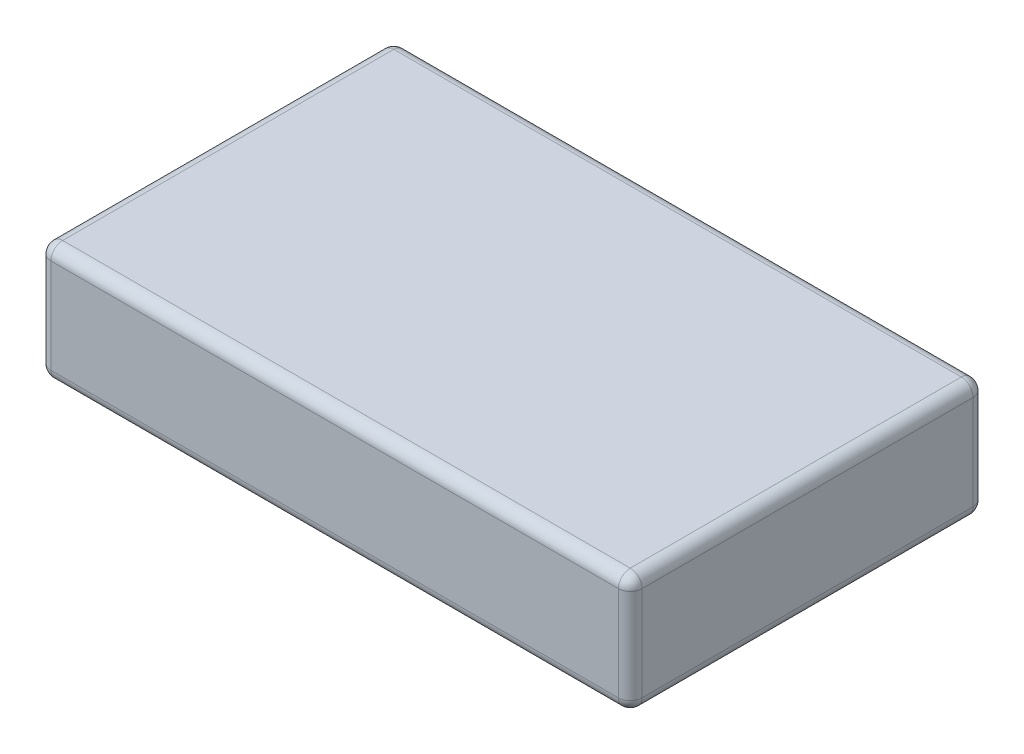
ISO-10303-21;
HEADER;
FILE_DESCRIPTION(('STEP AP214'),'2;1');
FILE_NAME('part.step','',(''),(''),'','','');
FILE_SCHEMA(('AUTOMOTIVE_DESIGN { 1 0 10303 214 1 1 1 1 }'));
ENDSEC;
DATA;
#1=APPLICATION_CONTEXT('core data for automotive mechanical design processes');
#2=APPLICATION_PROTOCOL_DEFINITION('international standard','automotive_design',2000,#1);
#3=PRODUCT_CONTEXT('',#1,'mechanical');
#4=PRODUCT('Part','Part','',(#3));
#5=PRODUCT_RELATED_PRODUCT_CATEGORY('part','',(#4));
#6=PRODUCT_DEFINITION_FORMATION('','',#4);
#7=PRODUCT_DEFINITION_CONTEXT('part definition',#1,'design');
#8=PRODUCT_DEFINITION('design','',#6,#7);
#9=PRODUCT_DEFINITION_SHAPE('','',#8);
#10=(LENGTH_UNIT() NAMED_UNIT(*) SI_UNIT(.MILLI.,.METRE.));
#11=(NAMED_UNIT(*) PLANE_ANGLE_UNIT() SI_UNIT($,.RADIAN.));
#12=(NAMED_UNIT(*) SI_UNIT($,.STERADIAN.) SOLID_ANGLE_UNIT());
#13=UNCERTAINTY_MEASURE_WITH_UNIT(LENGTH_MEASURE(1.E-05),#10,'distance_accuracy_value','');
#14=(GEOMETRIC_REPRESENTATION_CONTEXT(3) GLOBAL_UNCERTAINTY_ASSIGNED_CONTEXT((#13)) GLOBAL_UNIT_ASSIGNED_CONTEXT((#10,
#11,#12)) REPRESENTATION_CONTEXT('',''));
#15=CARTESIAN_POINT('',(0.,0.,0.));
#16=DIRECTION('',(0.,0.,1.));
#17=DIRECTION('',(1.,0.,0.));
#18=AXIS2_PLACEMENT_3D('',#15,#16,#17);
#19=CARTESIAN_POINT('',(-25.,10.,15.));
#20=DIRECTION('',(1.,0.,0.));
#21=DIRECTION('',(0.,0.,-1.));
#22=AXIS2_PLACEMENT_3D('',#19,#20,#21);
#23=PLANE('',#22);
#24=DIRECTION('',(0.,-1.,0.));
#25=VECTOR('',#24,1.);
#26=CARTESIAN_POINT('',(-25.,10.,-14.));
#27=LINE('',#26,#25);
#28=CARTESIAN_POINT('',(-25.,9.,-14.));
#29=VERTEX_POINT('',#28);
#30=CARTESIAN_POINT('',(-25.,0.999999999999999,-14.));
#31=VERTEX_POINT('',#30);
#32=EDGE_CURVE('E137',#29,#31,#27,.T.);
#33=ORIENTED_EDGE('',*,*,#32,.T.);
#34=DIRECTION('',(0.,0.,1.));
#35=VECTOR('',#34,1.);
#36=CARTESIAN_POINT('',(-25.,0.999999999999999,15.));
#37=LINE('',#36,#35);
#38=CARTESIAN_POINT('',(-25.,0.999999999999999,14.));
#39=VERTEX_POINT('',#38);
#40=EDGE_CURVE('E133',#31,#39,#37,.T.);
#41=ORIENTED_EDGE('',*,*,#40,.T.);
#42=DIRECTION('',(0.,-1.,0.));
#43=VECTOR('',#42,1.);
#44=CARTESIAN_POINT('',(-25.,10.,14.));
#45=LINE('',#44,#43);
#46=CARTESIAN_POINT('',(-25.,9.,14.));
#47=VERTEX_POINT('',#46);
#48=EDGE_CURVE('E126',#39,#47,#45,.F.);
#49=ORIENTED_EDGE('',*,*,#48,.T.);
#50=DIRECTION('',(0.,0.,1.));
#51=VECTOR('',#50,1.);
#52=CARTESIAN_POINT('',(-25.,9.,15.));
#53=LINE('',#52,#51);
#54=EDGE_CURVE('E130',#47,#29,#53,.F.);
#55=ORIENTED_EDGE('',*,*,#54,.T.);
#56=EDGE_LOOP('',(#33,#41,#49,#55));
#57=FACE_BOUND('',#56,.T.);
#58=ADVANCED_FACE('F38',(#57),#23,.F.);
#59=CARTESIAN_POINT('',(-25.,10.,15.));
#60=DIRECTION('',(0.,0.,-1.));
#61=DIRECTION('',(-1.,0.,0.));
#62=AXIS2_PLACEMENT_3D('',#59,#60,#61);
#63=PLANE('',#62);
#64=DIRECTION('',(0.,-1.,0.));
#65=VECTOR('',#64,1.);
#66=CARTESIAN_POINT('',(-24.,10.,15.));
#67=LINE('',#66,#65);
#68=CARTESIAN_POINT('',(-24.,9.,15.));
#69=VERTEX_POINT('',#68);
#70=CARTESIAN_POINT('',(-24.,0.999999999999999,15.));
#71=VERTEX_POINT('',#70);
#72=EDGE_CURVE('E145',#69,#71,#67,.T.);
#73=ORIENTED_EDGE('',*,*,#72,.T.);
#74=DIRECTION('',(1.,0.,0.));
#75=VECTOR('',#74,1.);
#76=CARTESIAN_POINT('',(25.,0.999999999999999,15.));
#77=LINE('',#76,#75);
#78=CARTESIAN_POINT('',(24.,0.999999999999999,15.));
#79=VERTEX_POINT('',#78);
#80=EDGE_CURVE('E183',#71,#79,#77,.T.);
#81=ORIENTED_EDGE('',*,*,#80,.T.);
#82=DIRECTION('',(0.,-1.,0.));
#83=VECTOR('',#82,1.);
#84=CARTESIAN_POINT('',(24.,10.,15.));
#85=LINE('',#84,#83);
#86=CARTESIAN_POINT('',(24.,9.,15.));
#87=VERTEX_POINT('',#86);
#88=EDGE_CURVE('E180',#79,#87,#85,.F.);
#89=ORIENTED_EDGE('',*,*,#88,.T.);
#90=DIRECTION('',(1.,0.,0.));
#91=VECTOR('',#90,1.);
#92=CARTESIAN_POINT('',(-25.,9.,15.));
#93=LINE('',#92,#91);
#94=EDGE_CURVE('E178',#87,#69,#93,.F.);
#95=ORIENTED_EDGE('',*,*,#94,.T.);
#96=EDGE_LOOP('',(#73,#81,#89,#95));
#97=FACE_BOUND('',#96,.T.);
#98=ADVANCED_FACE('F300',(#97),#63,.F.);
#99=CARTESIAN_POINT('',(25.,10.,15.));
#100=DIRECTION('',(-1.,0.,0.));
#101=DIRECTION('',(0.,0.,1.));
#102=AXIS2_PLACEMENT_3D('',#99,#100,#101);
#103=PLANE('',#102);
#104=DIRECTION('',(0.,-1.,0.));
#105=VECTOR('',#104,1.);
#106=CARTESIAN_POINT('',(25.,10.,14.));
#107=LINE('',#106,#105);
#108=CARTESIAN_POINT('',(25.,9.,14.));
#109=VERTEX_POINT('',#108);
#110=CARTESIAN_POINT('',(25.,0.999999999999999,14.));
#111=VERTEX_POINT('',#110);
#112=EDGE_CURVE('E189',#109,#111,#107,.T.);
#113=ORIENTED_EDGE('',*,*,#112,.T.);
#114=DIRECTION('',(0.,0.,-1.));
#115=VECTOR('',#114,1.);
#116=CARTESIAN_POINT('',(25.,0.999999999999999,-15.));
#117=LINE('',#116,#115);
#118=CARTESIAN_POINT('',(25.,0.999999999999999,-14.));
#119=VERTEX_POINT('',#118);
#120=EDGE_CURVE('E192',#111,#119,#117,.T.);
#121=ORIENTED_EDGE('',*,*,#120,.T.);
#122=DIRECTION('',(0.,-1.,0.));
#123=VECTOR('',#122,1.);
#124=CARTESIAN_POINT('',(25.,10.,-14.));
#125=LINE('',#124,#123);
#126=CARTESIAN_POINT('',(25.,9.,-14.));
#127=VERTEX_POINT('',#126);
#128=EDGE_CURVE('E187',#119,#127,#125,.F.);
#129=ORIENTED_EDGE('',*,*,#128,.T.);
#130=DIRECTION('',(0.,0.,-1.));
#131=VECTOR('',#130,1.);
#132=CARTESIAN_POINT('',(25.,9.,15.));
#133=LINE('',#132,#131);
#134=EDGE_CURVE('E185',#127,#109,#133,.F.);
#135=ORIENTED_EDGE('',*,*,#134,.T.);
#136=EDGE_LOOP('',(#113,#121,#129,#135));
#137=FACE_BOUND('',#136,.T.);
#138=ADVANCED_FACE('F277',(#137),#103,.F.);
#139=CARTESIAN_POINT('',(-25.,10.,-15.));
#140=DIRECTION('',(0.,0.,1.));
#141=DIRECTION('',(1.,0.,0.));
#142=AXIS2_PLACEMENT_3D('',#139,#140,#141);
#143=PLANE('',#142);
#144=DIRECTION('',(0.,-1.,0.));
#145=VECTOR('',#144,1.);
#146=CARTESIAN_POINT('',(24.,10.,-15.));
#147=LINE('',#146,#145);
#148=CARTESIAN_POINT('',(24.,9.,-15.));
#149=VERTEX_POINT('',#148);
#150=CARTESIAN_POINT('',(24.,0.999999999999999,-15.));
#151=VERTEX_POINT('',#150);
#152=EDGE_CURVE('E171',#149,#151,#147,.T.);
#153=ORIENTED_EDGE('',*,*,#152,.T.);
#154=DIRECTION('',(-1.,0.,0.));
#155=VECTOR('',#154,1.);
#156=CARTESIAN_POINT('',(-25.,0.999999999999999,-15.));
#157=LINE('',#156,#155);
#158=CARTESIAN_POINT('',(-24.,0.999999999999999,-15.));
#159=VERTEX_POINT('',#158);
#160=EDGE_CURVE('E176',#151,#159,#157,.T.);
#161=ORIENTED_EDGE('',*,*,#160,.T.);
#162=DIRECTION('',(0.,-1.,0.));
#163=VECTOR('',#162,1.);
#164=CARTESIAN_POINT('',(-24.,10.,-15.));
#165=LINE('',#164,#163);
#166=CARTESIAN_POINT('',(-24.,9.,-15.));
#167=VERTEX_POINT('',#166);
#168=EDGE_CURVE('E173',#159,#167,#165,.F.);
#169=ORIENTED_EDGE('',*,*,#168,.T.);
#170=DIRECTION('',(-1.,0.,0.));
#171=VECTOR('',#170,1.);
#172=CARTESIAN_POINT('',(-25.,9.,-15.));
#173=LINE('',#172,#171);
#174=EDGE_CURVE('E169',#167,#149,#173,.F.);
#175=ORIENTED_EDGE('',*,*,#174,.T.);
#176=EDGE_LOOP('',(#153,#161,#169,#175));
#177=FACE_BOUND('',#176,.T.);
#178=ADVANCED_FACE('F307',(#177),#143,.F.);
#179=CARTESIAN_POINT('',(0.,10.,0.));
#180=DIRECTION('',(0.,-1.,0.));
#181=DIRECTION('',(0.,0.,-1.));
#182=AXIS2_PLACEMENT_3D('',#179,#180,#181);
#183=PLANE('',#182);
#184=DIRECTION('',(0.,0.,-1.));
#185=VECTOR('',#184,1.);
#186=CARTESIAN_POINT('',(24.,10.,0.));
#187=LINE('',#186,#185);
#188=CARTESIAN_POINT('',(24.,10.,14.));
#189=VERTEX_POINT('',#188);
#190=CARTESIAN_POINT('',(24.,10.,-14.));
#191=VERTEX_POINT('',#190);
#192=EDGE_CURVE('E47',#189,#191,#187,.T.);
#193=ORIENTED_EDGE('',*,*,#192,.T.);
#194=DIRECTION('',(-1.,0.,0.));
#195=VECTOR('',#194,1.);
#196=CARTESIAN_POINT('',(0.,10.,-14.));
#197=LINE('',#196,#195);
#198=CARTESIAN_POINT('',(-24.,10.,-14.));
#199=VERTEX_POINT('',#198);
#200=EDGE_CURVE('E11',#191,#199,#197,.T.);
#201=ORIENTED_EDGE('',*,*,#200,.T.);
#202=DIRECTION('',(0.,0.,1.));
#203=VECTOR('',#202,1.);
#204=CARTESIAN_POINT('',(-24.,10.,0.));
#205=LINE('',#204,#203);
#206=CARTESIAN_POINT('',(-24.,10.,14.));
#207=VERTEX_POINT('',#206);
#208=EDGE_CURVE('E203',#199,#207,#205,.T.);
#209=ORIENTED_EDGE('',*,*,#208,.T.);
#210=DIRECTION('',(1.,0.,0.));
#211=VECTOR('',#210,1.);
#212=CARTESIAN_POINT('',(0.,10.,14.));
#213=LINE('',#212,#211);
#214=EDGE_CURVE('E58',#207,#189,#213,.T.);
#215=ORIENTED_EDGE('',*,*,#214,.T.);
#216=EDGE_LOOP('',(#193,#201,#209,#215));
#217=FACE_BOUND('',#216,.T.);
#218=ADVANCED_FACE('F370',(#217),#183,.F.);
#219=CARTESIAN_POINT('',(0.,0.,0.));
#220=DIRECTION('',(0.,-1.,0.));
#221=DIRECTION('',(0.,0.,-1.));
#222=AXIS2_PLACEMENT_3D('',#219,#220,#221);
#223=PLANE('',#222);
#224=DIRECTION('',(0.,0.,-1.));
#225=VECTOR('',#224,1.);
#226=CARTESIAN_POINT('',(24.,0.,15.));
#227=LINE('',#226,#225);
#228=CARTESIAN_POINT('',(24.,0.,-14.));
#229=VERTEX_POINT('',#228);
#230=CARTESIAN_POINT('',(24.,0.,14.));
#231=VERTEX_POINT('',#230);
#232=EDGE_CURVE('E198',#229,#231,#227,.F.);
#233=ORIENTED_EDGE('',*,*,#232,.T.);
#234=DIRECTION('',(1.,0.,0.));
#235=VECTOR('',#234,1.);
#236=CARTESIAN_POINT('',(-25.,0.,14.));
#237=LINE('',#236,#235);
#238=CARTESIAN_POINT('',(-24.,0.,14.));
#239=VERTEX_POINT('',#238);
#240=EDGE_CURVE('E200',#231,#239,#237,.F.);
#241=ORIENTED_EDGE('',*,*,#240,.T.);
#242=DIRECTION('',(0.,0.,1.));
#243=VECTOR('',#242,1.);
#244=CARTESIAN_POINT('',(-24.,0.,-15.));
#245=LINE('',#244,#243);
#246=CARTESIAN_POINT('',(-24.,0.,-14.));
#247=VERTEX_POINT('',#246);
#248=EDGE_CURVE('E194',#239,#247,#245,.F.);
#249=ORIENTED_EDGE('',*,*,#248,.T.);
#250=DIRECTION('',(-1.,0.,0.));
#251=VECTOR('',#250,1.);
#252=CARTESIAN_POINT('',(25.,0.,-14.));
#253=LINE('',#252,#251);
#254=EDGE_CURVE('E196',#247,#229,#253,.F.);
#255=ORIENTED_EDGE('',*,*,#254,.T.);
#256=EDGE_LOOP('',(#233,#241,#249,#255));
#257=FACE_BOUND('',#256,.T.);
#258=ADVANCED_FACE('F269',(#257),#223,.T.);
#259=CARTESIAN_POINT('',(24.,10.,14.));
#260=DIRECTION('',(0.,-1.,0.));
#261=DIRECTION('',(0.,0.,-1.));
#262=AXIS2_PLACEMENT_3D('',#259,#260,#261);
#263=CYLINDRICAL_SURFACE('',#262,1.);
#264=CARTESIAN_POINT('',(24.,9.,14.));
#265=DIRECTION('',(0.,1.,0.));
#266=DIRECTION('',(0.,0.,1.));
#267=AXIS2_PLACEMENT_3D('',#264,#265,#266);
#268=CIRCLE('',#267,1.);
#269=EDGE_CURVE('E42',#87,#109,#268,.T.);
#270=ORIENTED_EDGE('',*,*,#269,.F.);
#271=ORIENTED_EDGE('',*,*,#88,.F.);
#272=CARTESIAN_POINT('',(24.,0.999999999999999,14.));
#273=DIRECTION('',(0.,-1.,0.));
#274=DIRECTION('',(0.,0.,-1.));
#275=AXIS2_PLACEMENT_3D('',#272,#273,#274);
#276=CIRCLE('',#275,1.);
#277=EDGE_CURVE('E165',#111,#79,#276,.T.);
#278=ORIENTED_EDGE('',*,*,#277,.F.);
#279=ORIENTED_EDGE('',*,*,#112,.F.);
#280=EDGE_LOOP('',(#270,#271,#278,#279));
#281=FACE_BOUND('',#280,.T.);
#282=ADVANCED_FACE('F40',(#281),#263,.T.);
#283=CARTESIAN_POINT('',(24.,9.,14.));
#284=DIRECTION('',(1.,0.,0.));
#285=DIRECTION('',(0.,0.,-1.));
#286=AXIS2_PLACEMENT_3D('',#283,#284,#285);
#287=SPHERICAL_SURFACE('',#286,1.);
#288=CARTESIAN_POINT('',(24.,9.,14.));
#289=DIRECTION('',(1.,0.,0.));
#290=DIRECTION('',(0.,0.,-1.));
#291=AXIS2_PLACEMENT_3D('',#288,#289,#290);
#292=CIRCLE('',#291,1.);
#293=EDGE_CURVE('E250',#87,#189,#292,.F.);
#294=ORIENTED_EDGE('',*,*,#293,.F.);
#295=ORIENTED_EDGE('',*,*,#269,.T.);
#296=CARTESIAN_POINT('',(24.,9.,14.));
#297=DIRECTION('',(0.,0.,1.));
#298=DIRECTION('',(1.,0.,0.));
#299=AXIS2_PLACEMENT_3D('',#296,#297,#298);
#300=CIRCLE('',#299,1.);
#301=EDGE_CURVE('E252',#189,#109,#300,.F.);
#302=ORIENTED_EDGE('',*,*,#301,.F.);
#303=EDGE_LOOP('',(#294,#295,#302));
#304=FACE_BOUND('',#303,.T.);
#305=ADVANCED_FACE('F295',(#304),#287,.T.);
#306=CARTESIAN_POINT('',(24.,1.,14.));
#307=DIRECTION('',(0.,0.,1.));
#308=DIRECTION('',(0.,-1.,0.));
#309=AXIS2_PLACEMENT_3D('',#306,#307,#308);
#310=SPHERICAL_SURFACE('',#309,1.);
#311=CARTESIAN_POINT('',(24.,1.,14.));
#312=DIRECTION('',(0.,0.,1.));
#313=DIRECTION('',(1.,0.,0.));
#314=AXIS2_PLACEMENT_3D('',#311,#312,#313);
#315=CIRCLE('',#314,1.);
#316=EDGE_CURVE('E244',#111,#231,#315,.F.);
#317=ORIENTED_EDGE('',*,*,#316,.F.);
#318=ORIENTED_EDGE('',*,*,#277,.T.);
#319=CARTESIAN_POINT('',(24.,0.999999999999999,14.));
#320=DIRECTION('',(1.,0.,0.));
#321=DIRECTION('',(0.,0.,-1.));
#322=AXIS2_PLACEMENT_3D('',#319,#320,#321);
#323=CIRCLE('',#322,1.);
#324=EDGE_CURVE('E247',#231,#79,#323,.F.);
#325=ORIENTED_EDGE('',*,*,#324,.F.);
#326=EDGE_LOOP('',(#317,#318,#325));
#327=FACE_BOUND('',#326,.T.);
#328=ADVANCED_FACE('F259',(#327),#310,.T.);
#329=CARTESIAN_POINT('',(24.,9.,0.));
#330=DIRECTION('',(0.,0.,-1.));
#331=DIRECTION('',(-1.,0.,0.));
#332=AXIS2_PLACEMENT_3D('',#329,#330,#331);
#333=CYLINDRICAL_SURFACE('',#332,1.);
#334=ORIENTED_EDGE('',*,*,#301,.T.);
#335=ORIENTED_EDGE('',*,*,#134,.F.);
#336=CARTESIAN_POINT('',(24.,9.,-14.));
#337=DIRECTION('',(0.,0.,-1.));
#338=DIRECTION('',(-1.,0.,0.));
#339=AXIS2_PLACEMENT_3D('',#336,#337,#338);
#340=CIRCLE('',#339,1.);
#341=EDGE_CURVE('E238',#191,#127,#340,.T.);
#342=ORIENTED_EDGE('',*,*,#341,.F.);
#343=ORIENTED_EDGE('',*,*,#192,.F.);
#344=EDGE_LOOP('',(#334,#335,#342,#343));
#345=FACE_BOUND('',#344,.T.);
#346=ADVANCED_FACE('F290',(#345),#333,.T.);
#347=CARTESIAN_POINT('',(0.,9.,14.));
#348=DIRECTION('',(1.,0.,0.));
#349=DIRECTION('',(0.,0.,-1.));
#350=AXIS2_PLACEMENT_3D('',#347,#348,#349);
#351=CYLINDRICAL_SURFACE('',#350,1.);
#352=ORIENTED_EDGE('',*,*,#293,.T.);
#353=ORIENTED_EDGE('',*,*,#214,.F.);
#354=CARTESIAN_POINT('',(-24.,9.,14.));
#355=DIRECTION('',(-1.,0.,0.));
#356=DIRECTION('',(0.,0.,1.));
#357=AXIS2_PLACEMENT_3D('',#354,#355,#356);
#358=CIRCLE('',#357,1.);
#359=EDGE_CURVE('E149',#69,#207,#358,.T.);
#360=ORIENTED_EDGE('',*,*,#359,.F.);
#361=ORIENTED_EDGE('',*,*,#94,.F.);
#362=EDGE_LOOP('',(#352,#353,#360,#361));
#363=FACE_BOUND('',#362,.T.);
#364=ADVANCED_FACE('F298',(#363),#351,.T.);
#365=CARTESIAN_POINT('',(-24.,10.,14.));
#366=DIRECTION('',(0.,-1.,0.));
#367=DIRECTION('',(0.,0.,-1.));
#368=AXIS2_PLACEMENT_3D('',#365,#366,#367);
#369=CYLINDRICAL_SURFACE('',#368,1.);
#370=CARTESIAN_POINT('',(-24.,0.999999999999999,14.));
#371=DIRECTION('',(0.,-1.,0.));
#372=DIRECTION('',(0.,0.,-1.));
#373=AXIS2_PLACEMENT_3D('',#370,#371,#372);
#374=CIRCLE('',#373,1.);
#375=EDGE_CURVE('E150',#71,#39,#374,.T.);
#376=ORIENTED_EDGE('',*,*,#375,.F.);
#377=ORIENTED_EDGE('',*,*,#72,.F.);
#378=CARTESIAN_POINT('',(-24.,9.,14.));
#379=DIRECTION('',(0.,1.,0.));
#380=DIRECTION('',(0.,0.,1.));
#381=AXIS2_PLACEMENT_3D('',#378,#379,#380);
#382=CIRCLE('',#381,1.);
#383=EDGE_CURVE('E141',#47,#69,#382,.T.);
#384=ORIENTED_EDGE('',*,*,#383,.F.);
#385=ORIENTED_EDGE('',*,*,#48,.F.);
#386=EDGE_LOOP('',(#376,#377,#384,#385));
#387=FACE_BOUND('',#386,.T.);
#388=ADVANCED_FACE('F143',(#387),#369,.T.);
#389=CARTESIAN_POINT('',(-25.,0.999999999999999,14.));
#390=DIRECTION('',(-1.,0.,0.));
#391=DIRECTION('',(0.,0.,1.));
#392=AXIS2_PLACEMENT_3D('',#389,#390,#391);
#393=CYLINDRICAL_SURFACE('',#392,1.);
#394=ORIENTED_EDGE('',*,*,#324,.T.);
#395=ORIENTED_EDGE('',*,*,#80,.F.);
#396=CARTESIAN_POINT('',(-24.,1.,14.));
#397=DIRECTION('',(-1.,0.,0.));
#398=DIRECTION('',(0.,0.,1.));
#399=AXIS2_PLACEMENT_3D('',#396,#397,#398);
#400=CIRCLE('',#399,1.);
#401=EDGE_CURVE('E234',#239,#71,#400,.T.);
#402=ORIENTED_EDGE('',*,*,#401,.F.);
#403=ORIENTED_EDGE('',*,*,#240,.F.);
#404=EDGE_LOOP('',(#394,#395,#402,#403));
#405=FACE_BOUND('',#404,.T.);
#406=ADVANCED_FACE('F266',(#405),#393,.T.);
#407=CARTESIAN_POINT('',(24.,0.999999999999999,15.));
#408=DIRECTION('',(0.,0.,1.));
#409=DIRECTION('',(1.,0.,0.));
#410=AXIS2_PLACEMENT_3D('',#407,#408,#409);
#411=CYLINDRICAL_SURFACE('',#410,1.);
#412=ORIENTED_EDGE('',*,*,#316,.T.);
#413=ORIENTED_EDGE('',*,*,#232,.F.);
#414=CARTESIAN_POINT('',(24.,0.999999999999999,-14.));
#415=DIRECTION('',(0.,0.,-1.));
#416=DIRECTION('',(-1.,0.,0.));
#417=AXIS2_PLACEMENT_3D('',#414,#415,#416);
#418=CIRCLE('',#417,1.);
#419=EDGE_CURVE('E231',#119,#229,#418,.T.);
#420=ORIENTED_EDGE('',*,*,#419,.F.);
#421=ORIENTED_EDGE('',*,*,#120,.F.);
#422=EDGE_LOOP('',(#412,#413,#420,#421));
#423=FACE_BOUND('',#422,.T.);
#424=ADVANCED_FACE('F274',(#423),#411,.T.);
#425=CARTESIAN_POINT('',(24.,10.,-14.));
#426=DIRECTION('',(0.,-1.,0.));
#427=DIRECTION('',(0.,0.,-1.));
#428=AXIS2_PLACEMENT_3D('',#425,#426,#427);
#429=CYLINDRICAL_SURFACE('',#428,1.);
#430=CARTESIAN_POINT('',(24.,9.,-14.));
#431=DIRECTION('',(0.,1.,0.));
#432=DIRECTION('',(0.,0.,1.));
#433=AXIS2_PLACEMENT_3D('',#430,#431,#432);
#434=CIRCLE('',#433,1.);
#435=EDGE_CURVE('E241',#127,#149,#434,.T.);
#436=ORIENTED_EDGE('',*,*,#435,.F.);
#437=ORIENTED_EDGE('',*,*,#128,.F.);
#438=CARTESIAN_POINT('',(24.,0.999999999999999,-14.));
#439=DIRECTION('',(0.,-1.,0.));
#440=DIRECTION('',(0.,0.,-1.));
#441=AXIS2_PLACEMENT_3D('',#438,#439,#440);
#442=CIRCLE('',#441,1.);
#443=EDGE_CURVE('E228',#151,#119,#442,.T.);
#444=ORIENTED_EDGE('',*,*,#443,.F.);
#445=ORIENTED_EDGE('',*,*,#152,.F.);
#446=EDGE_LOOP('',(#436,#437,#444,#445));
#447=FACE_BOUND('',#446,.T.);
#448=ADVANCED_FACE('F282',(#447),#429,.T.);
#449=CARTESIAN_POINT('',(24.,9.,-14.));
#450=DIRECTION('',(1.,0.,0.));
#451=DIRECTION('',(0.,0.,-1.));
#452=AXIS2_PLACEMENT_3D('',#449,#450,#451);
#453=SPHERICAL_SURFACE('',#452,1.);
#454=ORIENTED_EDGE('',*,*,#341,.T.);
#455=ORIENTED_EDGE('',*,*,#435,.T.);
#456=CARTESIAN_POINT('',(24.,9.,-14.));
#457=DIRECTION('',(1.,0.,0.));
#458=DIRECTION('',(0.,0.,-1.));
#459=AXIS2_PLACEMENT_3D('',#456,#457,#458);
#460=CIRCLE('',#459,1.);
#461=EDGE_CURVE('E157',#191,#149,#460,.F.);
#462=ORIENTED_EDGE('',*,*,#461,.F.);
#463=EDGE_LOOP('',(#454,#455,#462));
#464=FACE_BOUND('',#463,.T.);
#465=ADVANCED_FACE('F287',(#464),#453,.T.);
#466=CARTESIAN_POINT('',(-24.,9.,14.));
#467=DIRECTION('',(0.,0.,1.));
#468=DIRECTION('',(1.,0.,0.));
#469=AXIS2_PLACEMENT_3D('',#466,#467,#468);
#470=SPHERICAL_SURFACE('',#469,1.);
#471=ORIENTED_EDGE('',*,*,#383,.T.);
#472=ORIENTED_EDGE('',*,*,#359,.T.);
#473=CARTESIAN_POINT('',(-24.,9.,14.));
#474=DIRECTION('',(0.,0.,1.));
#475=DIRECTION('',(1.,0.,0.));
#476=AXIS2_PLACEMENT_3D('',#473,#474,#475);
#477=CIRCLE('',#476,1.);
#478=EDGE_CURVE('E153',#47,#207,#477,.F.);
#479=ORIENTED_EDGE('',*,*,#478,.F.);
#480=EDGE_LOOP('',(#471,#472,#479));
#481=FACE_BOUND('',#480,.T.);
#482=ADVANCED_FACE('F154',(#481),#470,.T.);
#483=CARTESIAN_POINT('',(-24.,1.,14.));
#484=DIRECTION('',(0.,0.,1.));
#485=DIRECTION('',(0.,-1.,0.));
#486=AXIS2_PLACEMENT_3D('',#483,#484,#485);
#487=SPHERICAL_SURFACE('',#486,1.);
#488=ORIENTED_EDGE('',*,*,#401,.T.);
#489=ORIENTED_EDGE('',*,*,#375,.T.);
#490=CARTESIAN_POINT('',(-24.,0.999999999999999,14.));
#491=DIRECTION('',(0.,0.,1.));
#492=DIRECTION('',(1.,0.,0.));
#493=AXIS2_PLACEMENT_3D('',#490,#491,#492);
#494=CIRCLE('',#493,1.);
#495=EDGE_CURVE('E158',#239,#39,#494,.F.);
#496=ORIENTED_EDGE('',*,*,#495,.F.);
#497=EDGE_LOOP('',(#488,#489,#496));
#498=FACE_BOUND('',#497,.T.);
#499=ADVANCED_FACE('F341',(#498),#487,.T.);
#500=CARTESIAN_POINT('',(24.,1.,-14.));
#501=DIRECTION('',(1.,0.,0.));
#502=DIRECTION('',(0.,1.,0.));
#503=AXIS2_PLACEMENT_3D('',#500,#501,#502);
#504=SPHERICAL_SURFACE('',#503,1.);
#505=ORIENTED_EDGE('',*,*,#443,.T.);
#506=ORIENTED_EDGE('',*,*,#419,.T.);
#507=CARTESIAN_POINT('',(24.,1.,-14.));
#508=DIRECTION('',(1.,0.,0.));
#509=DIRECTION('',(0.,0.,-1.));
#510=AXIS2_PLACEMENT_3D('',#507,#508,#509);
#511=CIRCLE('',#510,1.);
#512=EDGE_CURVE('E221',#151,#229,#511,.F.);
#513=ORIENTED_EDGE('',*,*,#512,.F.);
#514=EDGE_LOOP('',(#505,#506,#513));
#515=FACE_BOUND('',#514,.T.);
#516=ADVANCED_FACE('F337',(#515),#504,.T.);
#517=CARTESIAN_POINT('',(0.,9.,-14.));
#518=DIRECTION('',(-1.,0.,0.));
#519=DIRECTION('',(0.,0.,1.));
#520=AXIS2_PLACEMENT_3D('',#517,#518,#519);
#521=CYLINDRICAL_SURFACE('',#520,1.);
#522=ORIENTED_EDGE('',*,*,#461,.T.);
#523=ORIENTED_EDGE('',*,*,#174,.F.);
#524=CARTESIAN_POINT('',(-24.,9.,-14.));
#525=DIRECTION('',(-1.,0.,0.));
#526=DIRECTION('',(0.,0.,1.));
#527=AXIS2_PLACEMENT_3D('',#524,#525,#526);
#528=CIRCLE('',#527,1.);
#529=EDGE_CURVE('E218',#199,#167,#528,.T.);
#530=ORIENTED_EDGE('',*,*,#529,.F.);
#531=ORIENTED_EDGE('',*,*,#200,.F.);
#532=EDGE_LOOP('',(#522,#523,#530,#531));
#533=FACE_BOUND('',#532,.T.);
#534=ADVANCED_FACE('F334',(#533),#521,.T.);
#535=CARTESIAN_POINT('',(-24.,9.,0.));
#536=DIRECTION('',(0.,0.,1.));
#537=DIRECTION('',(1.,0.,0.));
#538=AXIS2_PLACEMENT_3D('',#535,#536,#537);
#539=CYLINDRICAL_SURFACE('',#538,1.);
#540=ORIENTED_EDGE('',*,*,#478,.T.);
#541=ORIENTED_EDGE('',*,*,#208,.F.);
#542=CARTESIAN_POINT('',(-24.,9.,-14.));
#543=DIRECTION('',(0.,0.,-1.));
#544=DIRECTION('',(-1.,0.,0.));
#545=AXIS2_PLACEMENT_3D('',#542,#543,#544);
#546=CIRCLE('',#545,1.);
#547=EDGE_CURVE('E161',#29,#199,#546,.T.);
#548=ORIENTED_EDGE('',*,*,#547,.F.);
#549=ORIENTED_EDGE('',*,*,#54,.F.);
#550=EDGE_LOOP('',(#540,#541,#548,#549));
#551=FACE_BOUND('',#550,.T.);
#552=ADVANCED_FACE('F160',(#551),#539,.T.);
#553=CARTESIAN_POINT('',(-24.,0.999999999999999,15.));
#554=DIRECTION('',(0.,0.,-1.));
#555=DIRECTION('',(-1.,0.,0.));
#556=AXIS2_PLACEMENT_3D('',#553,#554,#555);
#557=CYLINDRICAL_SURFACE('',#556,1.);
#558=ORIENTED_EDGE('',*,*,#495,.T.);
#559=ORIENTED_EDGE('',*,*,#40,.F.);
#560=CARTESIAN_POINT('',(-24.,1.,-14.));
#561=DIRECTION('',(0.,0.,-1.));
#562=DIRECTION('',(-1.,0.,0.));
#563=AXIS2_PLACEMENT_3D('',#560,#561,#562);
#564=CIRCLE('',#563,1.);
#565=EDGE_CURVE('E214',#247,#31,#564,.T.);
#566=ORIENTED_EDGE('',*,*,#565,.F.);
#567=ORIENTED_EDGE('',*,*,#248,.F.);
#568=EDGE_LOOP('',(#558,#559,#566,#567));
#569=FACE_BOUND('',#568,.T.);
#570=ADVANCED_FACE('F327',(#569),#557,.T.);
#571=CARTESIAN_POINT('',(-25.,0.999999999999999,-14.));
#572=DIRECTION('',(1.,0.,0.));
#573=DIRECTION('',(0.,0.,-1.));
#574=AXIS2_PLACEMENT_3D('',#571,#572,#573);
#575=CYLINDRICAL_SURFACE('',#574,1.);
#576=ORIENTED_EDGE('',*,*,#512,.T.);
#577=ORIENTED_EDGE('',*,*,#254,.F.);
#578=CARTESIAN_POINT('',(-24.,0.999999999999999,-14.));
#579=DIRECTION('',(-1.,0.,0.));
#580=DIRECTION('',(0.,0.,1.));
#581=AXIS2_PLACEMENT_3D('',#578,#579,#580);
#582=CIRCLE('',#581,1.);
#583=EDGE_CURVE('E211',#159,#247,#582,.T.);
#584=ORIENTED_EDGE('',*,*,#583,.F.);
#585=ORIENTED_EDGE('',*,*,#160,.F.);
#586=EDGE_LOOP('',(#576,#577,#584,#585));
#587=FACE_BOUND('',#586,.T.);
#588=ADVANCED_FACE('F323',(#587),#575,.T.);
#589=CARTESIAN_POINT('',(-24.,9.,-14.));
#590=DIRECTION('',(0.,1.,0.));
#591=DIRECTION('',(0.,0.,1.));
#592=AXIS2_PLACEMENT_3D('',#589,#590,#591);
#593=SPHERICAL_SURFACE('',#592,1.);
#594=ORIENTED_EDGE('',*,*,#547,.T.);
#595=ORIENTED_EDGE('',*,*,#529,.T.);
#596=CARTESIAN_POINT('',(-24.,9.,-14.));
#597=DIRECTION('',(0.,1.,0.));
#598=DIRECTION('',(0.,0.,1.));
#599=AXIS2_PLACEMENT_3D('',#596,#597,#598);
#600=CIRCLE('',#599,1.);
#601=EDGE_CURVE('E209',#29,#167,#600,.F.);
#602=ORIENTED_EDGE('',*,*,#601,.F.);
#603=EDGE_LOOP('',(#594,#595,#602));
#604=FACE_BOUND('',#603,.T.);
#605=ADVANCED_FACE('F319',(#604),#593,.T.);
#606=CARTESIAN_POINT('',(-24.,1.,-14.));
#607=DIRECTION('',(0.,-1.,0.));
#608=DIRECTION('',(0.,0.,-1.));
#609=AXIS2_PLACEMENT_3D('',#606,#607,#608);
#610=SPHERICAL_SURFACE('',#609,1.);
#611=ORIENTED_EDGE('',*,*,#583,.T.);
#612=ORIENTED_EDGE('',*,*,#565,.T.);
#613=CARTESIAN_POINT('',(-24.,0.999999999999999,-14.));
#614=DIRECTION('',(0.,-1.,0.));
#615=DIRECTION('',(0.,0.,-1.));
#616=AXIS2_PLACEMENT_3D('',#613,#614,#615);
#617=CIRCLE('',#616,1.);
#618=EDGE_CURVE('E207',#159,#31,#617,.F.);
#619=ORIENTED_EDGE('',*,*,#618,.F.);
#620=EDGE_LOOP('',(#611,#612,#619));
#621=FACE_BOUND('',#620,.T.);
#622=ADVANCED_FACE('F315',(#621),#610,.T.);
#623=CARTESIAN_POINT('',(-24.,10.,-14.));
#624=DIRECTION('',(0.,-1.,0.));
#625=DIRECTION('',(0.,0.,-1.));
#626=AXIS2_PLACEMENT_3D('',#623,#624,#625);
#627=CYLINDRICAL_SURFACE('',#626,1.);
#628=ORIENTED_EDGE('',*,*,#601,.T.);
#629=ORIENTED_EDGE('',*,*,#168,.F.);
#630=ORIENTED_EDGE('',*,*,#618,.T.);
#631=ORIENTED_EDGE('',*,*,#32,.F.);
#632=EDGE_LOOP('',(#628,#629,#630,#631));
#633=FACE_BOUND('',#632,.T.);
#634=ADVANCED_FACE('F312',(#633),#627,.T.);
#635=CLOSED_SHELL('',(#58,#98,#138,#178,#218,#258,#282,#305,#328,#346,#364,#388,#406,#424,#448,
#465,#482,#499,#516,#534,#552,#570,#588,#605,#622,#634));
#636=MANIFOLD_SOLID_BREP('B2',#635);
#637=ADVANCED_BREP_SHAPE_REPRESENTATION('',(#18,#636),#14);
#638=SHAPE_DEFINITION_REPRESENTATION(#9,#637);
ENDSEC;
END-ISO-10303-21;
